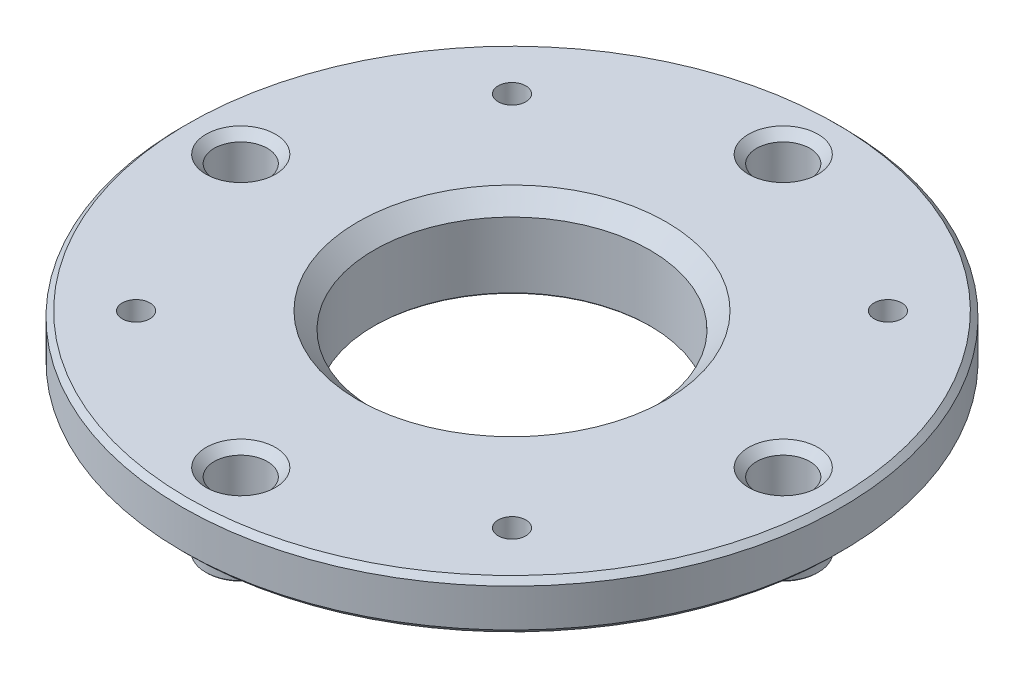
ISO-10303-21;
HEADER;
FILE_DESCRIPTION(('STEP AP214'),'2;1');
FILE_NAME('part.step','',(''),(''),'','','');
FILE_SCHEMA(('AUTOMOTIVE_DESIGN { 1 0 10303 214 1 1 1 1 }'));
ENDSEC;
DATA;
#1=APPLICATION_CONTEXT('core data for automotive mechanical design processes');
#2=APPLICATION_PROTOCOL_DEFINITION('international standard','automotive_design',2000,#1);
#3=PRODUCT_CONTEXT('',#1,'mechanical');
#4=PRODUCT('Part','Part','',(#3));
#5=PRODUCT_RELATED_PRODUCT_CATEGORY('part','',(#4));
#6=PRODUCT_DEFINITION_FORMATION('','',#4);
#7=PRODUCT_DEFINITION_CONTEXT('part definition',#1,'design');
#8=PRODUCT_DEFINITION('design','',#6,#7);
#9=PRODUCT_DEFINITION_SHAPE('','',#8);
#10=(LENGTH_UNIT() NAMED_UNIT(*) SI_UNIT(.MILLI.,.METRE.));
#11=(NAMED_UNIT(*) PLANE_ANGLE_UNIT() SI_UNIT($,.RADIAN.));
#12=(NAMED_UNIT(*) SI_UNIT($,.STERADIAN.) SOLID_ANGLE_UNIT());
#13=UNCERTAINTY_MEASURE_WITH_UNIT(LENGTH_MEASURE(1.E-05),#10,'distance_accuracy_value','');
#14=(GEOMETRIC_REPRESENTATION_CONTEXT(3) GLOBAL_UNCERTAINTY_ASSIGNED_CONTEXT((#13)) GLOBAL_UNIT_ASSIGNED_CONTEXT((#10,
#11,#12)) REPRESENTATION_CONTEXT('',''));
#15=CARTESIAN_POINT('',(0.,0.,0.));
#16=DIRECTION('',(0.,0.,1.));
#17=DIRECTION('',(1.,0.,0.));
#18=AXIS2_PLACEMENT_3D('',#15,#16,#17);
#19=CARTESIAN_POINT('',(0.,0.,0.));
#20=DIRECTION('',(0.,1.,0.));
#21=DIRECTION('',(0.,0.,1.));
#22=AXIS2_PLACEMENT_3D('',#19,#20,#21);
#23=PLANE('',#22);
#24=CARTESIAN_POINT('',(34.6482322781408,0.,34.6482322781409));
#25=DIRECTION('',(0.,-1.,0.));
#26=DIRECTION('',(0.,0.,-1.));
#27=AXIS2_PLACEMENT_3D('',#24,#25,#26);
#28=CIRCLE('',#27,2.55269999999999);
#29=CARTESIAN_POINT('',(34.6482322781408,0.,32.0955322781409));
#30=VERTEX_POINT('',#29);
#31=EDGE_CURVE('E240',#30,#30,#28,.T.);
#32=ORIENTED_EDGE('',*,*,#31,.F.);
#33=EDGE_LOOP('',(#32));
#34=FACE_BOUND('',#33,.T.);
#35=CARTESIAN_POINT('',(34.6482322781409,0.,-34.6482322781408));
#36=DIRECTION('',(0.,-1.,0.));
#37=DIRECTION('',(0.,0.,-1.));
#38=AXIS2_PLACEMENT_3D('',#35,#36,#37);
#39=CIRCLE('',#38,2.55269999999998);
#40=CARTESIAN_POINT('',(34.6482322781409,0.,-37.2009322781407));
#41=VERTEX_POINT('',#40);
#42=EDGE_CURVE('E233',#41,#41,#39,.T.);
#43=ORIENTED_EDGE('',*,*,#42,.F.);
#44=EDGE_LOOP('',(#43));
#45=FACE_BOUND('',#44,.T.);
#46=CARTESIAN_POINT('',(-34.6482322781408,0.,-34.6482322781409));
#47=DIRECTION('',(0.,-1.,0.));
#48=DIRECTION('',(0.,0.,-1.));
#49=AXIS2_PLACEMENT_3D('',#46,#47,#48);
#50=CIRCLE('',#49,2.55269999999998);
#51=CARTESIAN_POINT('',(-34.6482322781408,0.,-37.2009322781409));
#52=VERTEX_POINT('',#51);
#53=EDGE_CURVE('E225',#52,#52,#50,.T.);
#54=ORIENTED_EDGE('',*,*,#53,.F.);
#55=EDGE_LOOP('',(#54));
#56=FACE_BOUND('',#55,.T.);
#57=CARTESIAN_POINT('',(-34.6482322781409,0.,34.6482322781408));
#58=DIRECTION('',(0.,-1.,0.));
#59=DIRECTION('',(0.,0.,-1.));
#60=AXIS2_PLACEMENT_3D('',#57,#58,#59);
#61=CIRCLE('',#60,2.55269999999998);
#62=CARTESIAN_POINT('',(-34.6482322781409,0.,32.0955322781408));
#63=VERTEX_POINT('',#62);
#64=EDGE_CURVE('E217',#63,#63,#61,.T.);
#65=ORIENTED_EDGE('',*,*,#64,.F.);
#66=EDGE_LOOP('',(#65));
#67=FACE_BOUND('',#66,.T.);
#68=CARTESIAN_POINT('',(-50.,0.,0.));
#69=DIRECTION('',(0.,1.,0.));
#70=DIRECTION('',(0.,0.,1.));
#71=AXIS2_PLACEMENT_3D('',#68,#69,#70);
#72=CIRCLE('',#71,6.475);
#73=CARTESIAN_POINT('',(-50.,0.,6.47500000000001));
#74=VERTEX_POINT('',#73);
#75=EDGE_CURVE('E143',#74,#74,#72,.F.);
#76=ORIENTED_EDGE('',*,*,#75,.F.);
#77=EDGE_LOOP('',(#76));
#78=FACE_BOUND('',#77,.T.);
#79=CARTESIAN_POINT('',(50.,0.,0.));
#80=DIRECTION('',(0.,1.,0.));
#81=DIRECTION('',(0.,0.,1.));
#82=AXIS2_PLACEMENT_3D('',#79,#80,#81);
#83=CIRCLE('',#82,6.475);
#84=CARTESIAN_POINT('',(50.,0.,6.475));
#85=VERTEX_POINT('',#84);
#86=EDGE_CURVE('E151',#85,#85,#83,.F.);
#87=ORIENTED_EDGE('',*,*,#86,.F.);
#88=EDGE_LOOP('',(#87));
#89=FACE_BOUND('',#88,.T.);
#90=CARTESIAN_POINT('',(0.,0.,0.));
#91=DIRECTION('',(0.,1.,0.));
#92=DIRECTION('',(0.,0.,1.));
#93=AXIS2_PLACEMENT_3D('',#90,#91,#92);
#94=CIRCLE('',#93,59.75);
#95=CARTESIAN_POINT('',(0.,0.,59.75));
#96=VERTEX_POINT('',#95);
#97=EDGE_CURVE('E158',#96,#96,#94,.F.);
#98=ORIENTED_EDGE('',*,*,#97,.T.);
#99=EDGE_LOOP('',(#98));
#100=FACE_BOUND('',#99,.T.);
#101=CARTESIAN_POINT('',(0.,0.,0.));
#102=DIRECTION('',(0.,1.,0.));
#103=DIRECTION('',(0.,0.,1.));
#104=AXIS2_PLACEMENT_3D('',#101,#102,#103);
#105=CIRCLE('',#104,28.485);
#106=CARTESIAN_POINT('',(0.,0.,28.485));
#107=VERTEX_POINT('',#106);
#108=EDGE_CURVE('E210',#107,#107,#105,.F.);
#109=ORIENTED_EDGE('',*,*,#108,.F.);
#110=EDGE_LOOP('',(#109));
#111=FACE_BOUND('',#110,.T.);
#112=CARTESIAN_POINT('',(0.,0.,-50.));
#113=DIRECTION('',(0.,1.,0.));
#114=DIRECTION('',(0.,0.,1.));
#115=AXIS2_PLACEMENT_3D('',#112,#113,#114);
#116=CIRCLE('',#115,6.475);
#117=CARTESIAN_POINT('',(0.,0.,-43.525));
#118=VERTEX_POINT('',#117);
#119=EDGE_CURVE('E147',#118,#118,#116,.F.);
#120=ORIENTED_EDGE('',*,*,#119,.F.);
#121=EDGE_LOOP('',(#120));
#122=FACE_BOUND('',#121,.T.);
#123=CARTESIAN_POINT('',(0.,0.,50.));
#124=DIRECTION('',(0.,1.,0.));
#125=DIRECTION('',(0.,0.,1.));
#126=AXIS2_PLACEMENT_3D('',#123,#124,#125);
#127=CIRCLE('',#126,6.475);
#128=CARTESIAN_POINT('',(0.,0.,56.475));
#129=VERTEX_POINT('',#128);
#130=EDGE_CURVE('E139',#129,#129,#127,.F.);
#131=ORIENTED_EDGE('',*,*,#130,.F.);
#132=EDGE_LOOP('',(#131));
#133=FACE_BOUND('',#132,.T.);
#134=ADVANCED_FACE('F47',(#34,#45,#56,#67,#78,#89,#100,#111,#122,#133),#23,.F.);
#135=CARTESIAN_POINT('',(0.,9.,0.));
#136=DIRECTION('',(0.,1.,0.));
#137=DIRECTION('',(0.,0.,1.));
#138=AXIS2_PLACEMENT_3D('',#135,#136,#137);
#139=PLANE('',#138);
#140=CARTESIAN_POINT('',(34.6482322781408,9.,34.6482322781409));
#141=DIRECTION('',(0.,-1.,0.));
#142=DIRECTION('',(0.,0.,-1.));
#143=AXIS2_PLACEMENT_3D('',#140,#141,#142);
#144=CIRCLE('',#143,2.5527);
#145=CARTESIAN_POINT('',(34.6482322781408,9.,32.0955322781409));
#146=VERTEX_POINT('',#145);
#147=EDGE_CURVE('E237',#146,#146,#144,.T.);
#148=ORIENTED_EDGE('',*,*,#147,.T.);
#149=EDGE_LOOP('',(#148));
#150=FACE_BOUND('',#149,.T.);
#151=CARTESIAN_POINT('',(34.6482322781409,9.,-34.6482322781408));
#152=DIRECTION('',(0.,-1.,0.));
#153=DIRECTION('',(0.,0.,-1.));
#154=AXIS2_PLACEMENT_3D('',#151,#152,#153);
#155=CIRCLE('',#154,2.5527);
#156=CARTESIAN_POINT('',(34.6482322781409,9.,-37.2009322781408));
#157=VERTEX_POINT('',#156);
#158=EDGE_CURVE('E229',#157,#157,#155,.T.);
#159=ORIENTED_EDGE('',*,*,#158,.T.);
#160=EDGE_LOOP('',(#159));
#161=FACE_BOUND('',#160,.T.);
#162=CARTESIAN_POINT('',(-34.6482322781408,9.,-34.6482322781409));
#163=DIRECTION('',(0.,-1.,0.));
#164=DIRECTION('',(0.,0.,-1.));
#165=AXIS2_PLACEMENT_3D('',#162,#163,#164);
#166=CIRCLE('',#165,2.5527);
#167=CARTESIAN_POINT('',(-34.6482322781408,9.,-37.2009322781409));
#168=VERTEX_POINT('',#167);
#169=EDGE_CURVE('E221',#168,#168,#166,.T.);
#170=ORIENTED_EDGE('',*,*,#169,.T.);
#171=EDGE_LOOP('',(#170));
#172=FACE_BOUND('',#171,.T.);
#173=CARTESIAN_POINT('',(-34.6482322781409,9.,34.6482322781408));
#174=DIRECTION('',(0.,-1.,0.));
#175=DIRECTION('',(0.,0.,-1.));
#176=AXIS2_PLACEMENT_3D('',#173,#174,#175);
#177=CIRCLE('',#176,2.5527);
#178=CARTESIAN_POINT('',(-34.6482322781409,9.,32.0955322781408));
#179=VERTEX_POINT('',#178);
#180=EDGE_CURVE('E213',#179,#179,#177,.T.);
#181=ORIENTED_EDGE('',*,*,#180,.T.);
#182=EDGE_LOOP('',(#181));
#183=FACE_BOUND('',#182,.T.);
#184=CARTESIAN_POINT('',(0.,9.,0.));
#185=DIRECTION('',(0.,1.,0.));
#186=DIRECTION('',(0.,0.,1.));
#187=AXIS2_PLACEMENT_3D('',#184,#185,#186);
#188=CIRCLE('',#187,59.75);
#189=CARTESIAN_POINT('',(0.,9.,59.75));
#190=VERTEX_POINT('',#189);
#191=EDGE_CURVE('E155',#190,#190,#188,.T.);
#192=ORIENTED_EDGE('',*,*,#191,.T.);
#193=EDGE_LOOP('',(#192));
#194=FACE_BOUND('',#193,.T.);
#195=CARTESIAN_POINT('',(-50.,9.,0.));
#196=DIRECTION('',(0.,1.,0.));
#197=DIRECTION('',(0.,0.,1.));
#198=AXIS2_PLACEMENT_3D('',#195,#196,#197);
#199=CIRCLE('',#198,6.40219999999998);
#200=CARTESIAN_POINT('',(-50.,9.,6.40219999999999));
#201=VERTEX_POINT('',#200);
#202=EDGE_CURVE('E182',#201,#201,#199,.F.);
#203=ORIENTED_EDGE('',*,*,#202,.T.);
#204=EDGE_LOOP('',(#203));
#205=FACE_BOUND('',#204,.T.);
#206=CARTESIAN_POINT('',(0.,9.,50.));
#207=DIRECTION('',(0.,1.,0.));
#208=DIRECTION('',(0.,0.,1.));
#209=AXIS2_PLACEMENT_3D('',#206,#207,#208);
#210=CIRCLE('',#209,6.40219999999998);
#211=CARTESIAN_POINT('',(0.,9.,56.4022));
#212=VERTEX_POINT('',#211);
#213=EDGE_CURVE('E186',#212,#212,#210,.F.);
#214=ORIENTED_EDGE('',*,*,#213,.T.);
#215=EDGE_LOOP('',(#214));
#216=FACE_BOUND('',#215,.T.);
#217=CARTESIAN_POINT('',(50.,9.,0.));
#218=DIRECTION('',(0.,1.,0.));
#219=DIRECTION('',(0.,0.,1.));
#220=AXIS2_PLACEMENT_3D('',#217,#218,#219);
#221=CIRCLE('',#220,6.40219999999998);
#222=CARTESIAN_POINT('',(50.,9.,6.40219999999998));
#223=VERTEX_POINT('',#222);
#224=EDGE_CURVE('E190',#223,#223,#221,.F.);
#225=ORIENTED_EDGE('',*,*,#224,.T.);
#226=EDGE_LOOP('',(#225));
#227=FACE_BOUND('',#226,.T.);
#228=CARTESIAN_POINT('',(0.,9.,-50.));
#229=DIRECTION('',(0.,1.,0.));
#230=DIRECTION('',(0.,0.,1.));
#231=AXIS2_PLACEMENT_3D('',#228,#229,#230);
#232=CIRCLE('',#231,6.40219999999998);
#233=CARTESIAN_POINT('',(0.,9.,-43.5978));
#234=VERTEX_POINT('',#233);
#235=EDGE_CURVE('E194',#234,#234,#232,.F.);
#236=ORIENTED_EDGE('',*,*,#235,.T.);
#237=EDGE_LOOP('',(#236));
#238=FACE_BOUND('',#237,.T.);
#239=CARTESIAN_POINT('',(0.,9.,0.));
#240=DIRECTION('',(0.,1.,0.));
#241=DIRECTION('',(0.,0.,1.));
#242=AXIS2_PLACEMENT_3D('',#239,#240,#241);
#243=CIRCLE('',#242,28.425);
#244=CARTESIAN_POINT('',(0.,9.,28.425));
#245=VERTEX_POINT('',#244);
#246=EDGE_CURVE('E202',#245,#245,#243,.F.);
#247=ORIENTED_EDGE('',*,*,#246,.T.);
#248=EDGE_LOOP('',(#247));
#249=FACE_BOUND('',#248,.T.);
#250=ADVANCED_FACE('F249',(#150,#161,#172,#183,#194,#205,#216,#227,#238,#249),#139,.T.);
#251=CARTESIAN_POINT('',(0.,9.,0.));
#252=DIRECTION('',(0.,-1.,0.));
#253=DIRECTION('',(0.,0.,-1.));
#254=AXIS2_PLACEMENT_3D('',#251,#252,#253);
#255=CYLINDRICAL_SURFACE('',#254,60.75);
#256=CARTESIAN_POINT('',(0.,1.,0.));
#257=DIRECTION('',(0.,1.,0.));
#258=DIRECTION('',(0.,0.,1.));
#259=AXIS2_PLACEMENT_3D('',#256,#257,#258);
#260=CIRCLE('',#259,60.75);
#261=CARTESIAN_POINT('',(0.,1.,60.75));
#262=VERTEX_POINT('',#261);
#263=EDGE_CURVE('E162',#262,#262,#260,.T.);
#264=ORIENTED_EDGE('',*,*,#263,.T.);
#265=EDGE_LOOP('',(#264));
#266=FACE_BOUND('',#265,.T.);
#267=CARTESIAN_POINT('',(0.,8.,0.));
#268=DIRECTION('',(0.,1.,0.));
#269=DIRECTION('',(0.,0.,1.));
#270=AXIS2_PLACEMENT_3D('',#267,#268,#269);
#271=CIRCLE('',#270,60.75);
#272=CARTESIAN_POINT('',(0.,8.,60.75));
#273=VERTEX_POINT('',#272);
#274=EDGE_CURVE('E166',#273,#273,#271,.F.);
#275=ORIENTED_EDGE('',*,*,#274,.T.);
#276=EDGE_LOOP('',(#275));
#277=FACE_BOUND('',#276,.T.);
#278=ADVANCED_FACE('F338',(#266,#277),#255,.T.);
#279=CARTESIAN_POINT('',(0.,9.,-50.));
#280=DIRECTION('',(0.,-1.,0.));
#281=DIRECTION('',(0.,0.,-1.));
#282=AXIS2_PLACEMENT_3D('',#279,#280,#281);
#283=CYLINDRICAL_SURFACE('',#282,4.9022);
#284=CARTESIAN_POINT('',(0.,-4.5,-50.));
#285=DIRECTION('',(0.,-1.,0.));
#286=DIRECTION('',(0.,0.,-1.));
#287=AXIS2_PLACEMENT_3D('',#284,#285,#286);
#288=CIRCLE('',#287,4.9022);
#289=CARTESIAN_POINT('',(0.,-4.5,-54.9022));
#290=VERTEX_POINT('',#289);
#291=EDGE_CURVE('E103',#290,#290,#288,.T.);
#292=ORIENTED_EDGE('',*,*,#291,.T.);
#293=EDGE_LOOP('',(#292));
#294=FACE_BOUND('',#293,.T.);
#295=CARTESIAN_POINT('',(0.,7.50000000000003,-50.));
#296=DIRECTION('',(0.,1.,0.));
#297=DIRECTION('',(0.,0.,1.));
#298=AXIS2_PLACEMENT_3D('',#295,#296,#297);
#299=CIRCLE('',#298,4.9022);
#300=CARTESIAN_POINT('',(0.,7.50000000000003,-45.0978));
#301=VERTEX_POINT('',#300);
#302=EDGE_CURVE('E170',#301,#301,#299,.T.);
#303=ORIENTED_EDGE('',*,*,#302,.T.);
#304=EDGE_LOOP('',(#303));
#305=FACE_BOUND('',#304,.T.);
#306=ADVANCED_FACE('F334',(#294,#305),#283,.F.);
#307=CARTESIAN_POINT('',(0.,9.,0.));
#308=DIRECTION('',(0.,-1.,0.));
#309=DIRECTION('',(0.,0.,-1.));
#310=AXIS2_PLACEMENT_3D('',#307,#308,#309);
#311=CYLINDRICAL_SURFACE('',#310,25.425);
#312=CARTESIAN_POINT('',(0.,-6.10000000000003,0.));
#313=DIRECTION('',(0.,-1.,0.));
#314=DIRECTION('',(0.,0.,-1.));
#315=AXIS2_PLACEMENT_3D('',#312,#313,#314);
#316=CIRCLE('',#315,25.425);
#317=CARTESIAN_POINT('',(0.,-6.10000000000003,-25.425));
#318=VERTEX_POINT('',#317);
#319=EDGE_CURVE('E69',#318,#318,#316,.T.);
#320=ORIENTED_EDGE('',*,*,#319,.T.);
#321=EDGE_LOOP('',(#320));
#322=FACE_BOUND('',#321,.T.);
#323=CARTESIAN_POINT('',(0.,6.,0.));
#324=DIRECTION('',(0.,1.,0.));
#325=DIRECTION('',(0.,0.,1.));
#326=AXIS2_PLACEMENT_3D('',#323,#324,#325);
#327=CIRCLE('',#326,25.425);
#328=CARTESIAN_POINT('',(0.,6.,25.425));
#329=VERTEX_POINT('',#328);
#330=EDGE_CURVE('E206',#329,#329,#327,.T.);
#331=ORIENTED_EDGE('',*,*,#330,.T.);
#332=EDGE_LOOP('',(#331));
#333=FACE_BOUND('',#332,.T.);
#334=ADVANCED_FACE('F330',(#322,#333),#311,.F.);
#335=CARTESIAN_POINT('',(50.,9.,0.));
#336=DIRECTION('',(0.,-1.,0.));
#337=DIRECTION('',(0.,0.,-1.));
#338=AXIS2_PLACEMENT_3D('',#335,#336,#337);
#339=CYLINDRICAL_SURFACE('',#338,4.9022);
#340=CARTESIAN_POINT('',(50.,-4.5,0.));
#341=DIRECTION('',(0.,-1.,0.));
#342=DIRECTION('',(0.,0.,-1.));
#343=AXIS2_PLACEMENT_3D('',#340,#341,#342);
#344=CIRCLE('',#343,4.9022);
#345=CARTESIAN_POINT('',(50.,-4.5,-4.9022));
#346=VERTEX_POINT('',#345);
#347=EDGE_CURVE('E119',#346,#346,#344,.T.);
#348=ORIENTED_EDGE('',*,*,#347,.T.);
#349=EDGE_LOOP('',(#348));
#350=FACE_BOUND('',#349,.T.);
#351=CARTESIAN_POINT('',(50.,7.50000000000003,0.));
#352=DIRECTION('',(0.,1.,0.));
#353=DIRECTION('',(0.,0.,1.));
#354=AXIS2_PLACEMENT_3D('',#351,#352,#353);
#355=CIRCLE('',#354,4.9022);
#356=CARTESIAN_POINT('',(50.,7.50000000000003,4.9022));
#357=VERTEX_POINT('',#356);
#358=EDGE_CURVE('E174',#357,#357,#355,.T.);
#359=ORIENTED_EDGE('',*,*,#358,.T.);
#360=EDGE_LOOP('',(#359));
#361=FACE_BOUND('',#360,.T.);
#362=ADVANCED_FACE('F326',(#350,#361),#339,.F.);
#363=CARTESIAN_POINT('',(0.,9.,50.));
#364=DIRECTION('',(0.,-1.,0.));
#365=DIRECTION('',(0.,0.,-1.));
#366=AXIS2_PLACEMENT_3D('',#363,#364,#365);
#367=CYLINDRICAL_SURFACE('',#366,4.9022);
#368=CARTESIAN_POINT('',(0.,-4.5,50.));
#369=DIRECTION('',(0.,-1.,0.));
#370=DIRECTION('',(0.,0.,-1.));
#371=AXIS2_PLACEMENT_3D('',#368,#369,#370);
#372=CIRCLE('',#371,4.9022);
#373=CARTESIAN_POINT('',(0.,-4.5,45.0978));
#374=VERTEX_POINT('',#373);
#375=EDGE_CURVE('E135',#374,#374,#372,.T.);
#376=ORIENTED_EDGE('',*,*,#375,.T.);
#377=EDGE_LOOP('',(#376));
#378=FACE_BOUND('',#377,.T.);
#379=CARTESIAN_POINT('',(0.,7.50000000000003,50.));
#380=DIRECTION('',(0.,1.,0.));
#381=DIRECTION('',(0.,0.,1.));
#382=AXIS2_PLACEMENT_3D('',#379,#380,#381);
#383=CIRCLE('',#382,4.9022);
#384=CARTESIAN_POINT('',(0.,7.50000000000003,54.9022));
#385=VERTEX_POINT('',#384);
#386=EDGE_CURVE('E178',#385,#385,#383,.T.);
#387=ORIENTED_EDGE('',*,*,#386,.T.);
#388=EDGE_LOOP('',(#387));
#389=FACE_BOUND('',#388,.T.);
#390=ADVANCED_FACE('F322',(#378,#389),#367,.F.);
#391=CARTESIAN_POINT('',(-50.,9.,0.));
#392=DIRECTION('',(0.,-1.,0.));
#393=DIRECTION('',(0.,0.,-1.));
#394=AXIS2_PLACEMENT_3D('',#391,#392,#393);
#395=CYLINDRICAL_SURFACE('',#394,4.9022);
#396=CARTESIAN_POINT('',(-50.,-4.5,0.));
#397=DIRECTION('',(0.,-1.,0.));
#398=DIRECTION('',(0.,0.,-1.));
#399=AXIS2_PLACEMENT_3D('',#396,#397,#398);
#400=CIRCLE('',#399,4.9022);
#401=CARTESIAN_POINT('',(-50.,-4.5,-4.90219999999999));
#402=VERTEX_POINT('',#401);
#403=EDGE_CURVE('E87',#402,#402,#400,.T.);
#404=ORIENTED_EDGE('',*,*,#403,.T.);
#405=EDGE_LOOP('',(#404));
#406=FACE_BOUND('',#405,.T.);
#407=CARTESIAN_POINT('',(-50.,7.50000000000003,0.));
#408=DIRECTION('',(0.,1.,0.));
#409=DIRECTION('',(0.,0.,1.));
#410=AXIS2_PLACEMENT_3D('',#407,#408,#409);
#411=CIRCLE('',#410,4.9022);
#412=CARTESIAN_POINT('',(-50.,7.50000000000003,4.9022));
#413=VERTEX_POINT('',#412);
#414=EDGE_CURVE('E198',#413,#413,#411,.T.);
#415=ORIENTED_EDGE('',*,*,#414,.T.);
#416=EDGE_LOOP('',(#415));
#417=FACE_BOUND('',#416,.T.);
#418=ADVANCED_FACE('F316',(#406,#417),#395,.F.);
#419=CARTESIAN_POINT('',(0.,-6.35,0.));
#420=DIRECTION('',(0.,-1.,0.));
#421=DIRECTION('',(0.,0.,-1.));
#422=AXIS2_PLACEMENT_3D('',#419,#420,#421);
#423=PLANE('',#422);
#424=CARTESIAN_POINT('',(0.,-6.35,0.));
#425=DIRECTION('',(0.,-1.,0.));
#426=DIRECTION('',(0.,0.,-1.));
#427=AXIS2_PLACEMENT_3D('',#424,#425,#426);
#428=CIRCLE('',#427,27.485);
#429=CARTESIAN_POINT('',(0.,-6.35,-27.485));
#430=VERTEX_POINT('',#429);
#431=EDGE_CURVE('E56',#430,#430,#428,.T.);
#432=ORIENTED_EDGE('',*,*,#431,.T.);
#433=EDGE_LOOP('',(#432));
#434=FACE_BOUND('',#433,.T.);
#435=CARTESIAN_POINT('',(0.,-6.35,0.));
#436=DIRECTION('',(0.,-1.,0.));
#437=DIRECTION('',(0.,0.,-1.));
#438=AXIS2_PLACEMENT_3D('',#435,#436,#437);
#439=CIRCLE('',#438,25.675);
#440=CARTESIAN_POINT('',(0.,-6.35,-25.675));
#441=VERTEX_POINT('',#440);
#442=EDGE_CURVE('E63',#441,#441,#439,.F.);
#443=ORIENTED_EDGE('',*,*,#442,.T.);
#444=EDGE_LOOP('',(#443));
#445=FACE_BOUND('',#444,.T.);
#446=ADVANCED_FACE('F312',(#434,#445),#423,.T.);
#447=CARTESIAN_POINT('',(0.,-6.35,0.));
#448=DIRECTION('',(0.,1.,0.));
#449=DIRECTION('',(0.,0.,1.));
#450=AXIS2_PLACEMENT_3D('',#447,#448,#449);
#451=CYLINDRICAL_SURFACE('',#450,28.485);
#452=CARTESIAN_POINT('',(0.,-5.34999999999998,0.));
#453=DIRECTION('',(0.,-1.,0.));
#454=DIRECTION('',(0.,0.,-1.));
#455=AXIS2_PLACEMENT_3D('',#452,#453,#454);
#456=CIRCLE('',#455,28.485);
#457=CARTESIAN_POINT('',(0.,-5.34999999999998,-28.485));
#458=VERTEX_POINT('',#457);
#459=EDGE_CURVE('E10',#458,#458,#456,.F.);
#460=ORIENTED_EDGE('',*,*,#459,.T.);
#461=EDGE_LOOP('',(#460));
#462=FACE_BOUND('',#461,.T.);
#463=ORIENTED_EDGE('',*,*,#108,.T.);
#464=EDGE_LOOP('',(#463));
#465=FACE_BOUND('',#464,.T.);
#466=ADVANCED_FACE('F315',(#462,#465),#451,.T.);
#467=CARTESIAN_POINT('',(0.,6.,0.));
#468=DIRECTION('',(0.,1.,0.));
#469=DIRECTION('',(0.,0.,1.));
#470=AXIS2_PLACEMENT_3D('',#467,#468,#469);
#471=CONICAL_SURFACE('',#470,25.425,0.785398163397447);
#472=ORIENTED_EDGE('',*,*,#246,.F.);
#473=EDGE_LOOP('',(#472));
#474=FACE_BOUND('',#473,.T.);
#475=ORIENTED_EDGE('',*,*,#330,.F.);
#476=EDGE_LOOP('',(#475));
#477=FACE_BOUND('',#476,.T.);
#478=ADVANCED_FACE('F319',(#474,#477),#471,.F.);
#479=CARTESIAN_POINT('',(-50.,7.50000000000003,0.));
#480=DIRECTION('',(0.,1.,0.));
#481=DIRECTION('',(0.,0.,1.));
#482=AXIS2_PLACEMENT_3D('',#479,#480,#481);
#483=CONICAL_SURFACE('',#482,4.9022,0.785398163397452);
#484=ORIENTED_EDGE('',*,*,#202,.F.);
#485=EDGE_LOOP('',(#484));
#486=FACE_BOUND('',#485,.T.);
#487=ORIENTED_EDGE('',*,*,#414,.F.);
#488=EDGE_LOOP('',(#487));
#489=FACE_BOUND('',#488,.T.);
#490=ADVANCED_FACE('F352',(#486,#489),#483,.F.);
#491=CARTESIAN_POINT('',(0.,7.50000000000003,50.));
#492=DIRECTION('',(0.,1.,0.));
#493=DIRECTION('',(0.,0.,1.));
#494=AXIS2_PLACEMENT_3D('',#491,#492,#493);
#495=CONICAL_SURFACE('',#494,4.9022,0.785398163397452);
#496=CARTESIAN_POINT('',(0.,9.,56.4022));
#497=CARTESIAN_POINT('',(0.,8.984375,56.386575));
#498=CARTESIAN_POINT('',(0.,8.96875,56.37095));
#499=CARTESIAN_POINT('',(0.,8.9375,56.3397));
#500=CARTESIAN_POINT('',(0.,8.921875,56.324075));
#501=CARTESIAN_POINT('',(0.,8.890625,56.292825));
#502=CARTESIAN_POINT('',(0.,8.875,56.2772));
#503=CARTESIAN_POINT('',(0.,8.84375,56.24595));
#504=CARTESIAN_POINT('',(0.,8.828125,56.230325));
#505=CARTESIAN_POINT('',(0.,8.796875,56.199075));
#506=CARTESIAN_POINT('',(0.,8.78125,56.18345));
#507=CARTESIAN_POINT('',(0.,8.75,56.1522));
#508=CARTESIAN_POINT('',(0.,8.734375,56.136575));
#509=CARTESIAN_POINT('',(0.,8.703125,56.105325));
#510=CARTESIAN_POINT('',(0.,8.6875,56.0897));
#511=CARTESIAN_POINT('',(0.,8.65625,56.05845));
#512=CARTESIAN_POINT('',(0.,8.64062500000001,56.042825));
#513=CARTESIAN_POINT('',(0.,8.60937500000001,56.011575));
#514=CARTESIAN_POINT('',(0.,8.59375000000001,55.99595));
#515=CARTESIAN_POINT('',(0.,8.56250000000001,55.9647));
#516=CARTESIAN_POINT('',(0.,8.54687500000001,55.949075));
#517=CARTESIAN_POINT('',(0.,8.51562500000001,55.917825));
#518=CARTESIAN_POINT('',(0.,8.50000000000001,55.9022));
#519=CARTESIAN_POINT('',(0.,8.46875000000001,55.87095));
#520=CARTESIAN_POINT('',(0.,8.45312500000001,55.855325));
#521=CARTESIAN_POINT('',(0.,8.42187500000001,55.824075));
#522=CARTESIAN_POINT('',(0.,8.40625000000001,55.80845));
#523=CARTESIAN_POINT('',(0.,8.37500000000001,55.7772));
#524=CARTESIAN_POINT('',(0.,8.35937500000001,55.761575));
#525=CARTESIAN_POINT('',(0.,8.32812500000001,55.730325));
#526=CARTESIAN_POINT('',(0.,8.31250000000001,55.7147));
#527=CARTESIAN_POINT('',(0.,8.28125000000001,55.68345));
#528=CARTESIAN_POINT('',(0.,8.26562500000001,55.667825));
#529=CARTESIAN_POINT('',(0.,8.23437500000001,55.636575));
#530=CARTESIAN_POINT('',(0.,8.21875000000001,55.62095));
#531=CARTESIAN_POINT('',(0.,8.18750000000001,55.5897));
#532=CARTESIAN_POINT('',(0.,8.17187500000001,55.574075));
#533=CARTESIAN_POINT('',(0.,8.14062500000001,55.542825));
#534=CARTESIAN_POINT('',(0.,8.12500000000002,55.5272));
#535=CARTESIAN_POINT('',(0.,8.09375000000002,55.49595));
#536=CARTESIAN_POINT('',(0.,8.07812500000002,55.480325));
#537=CARTESIAN_POINT('',(0.,8.04687500000002,55.449075));
#538=CARTESIAN_POINT('',(0.,8.03125000000002,55.43345));
#539=CARTESIAN_POINT('',(0.,8.00000000000002,55.4022));
#540=CARTESIAN_POINT('',(0.,7.98437500000002,55.386575));
#541=CARTESIAN_POINT('',(0.,7.95312500000002,55.355325));
#542=CARTESIAN_POINT('',(0.,7.93750000000002,55.3397));
#543=CARTESIAN_POINT('',(0.,7.90625000000002,55.30845));
#544=CARTESIAN_POINT('',(0.,7.89062500000002,55.292825));
#545=CARTESIAN_POINT('',(0.,7.85937500000002,55.261575));
#546=CARTESIAN_POINT('',(0.,7.84375000000002,55.24595));
#547=CARTESIAN_POINT('',(0.,7.81250000000002,55.2147));
#548=CARTESIAN_POINT('',(0.,7.79687500000002,55.199075));
#549=CARTESIAN_POINT('',(0.,7.76562500000002,55.167825));
#550=CARTESIAN_POINT('',(0.,7.75000000000002,55.1522));
#551=CARTESIAN_POINT('',(0.,7.71875000000002,55.12095));
#552=CARTESIAN_POINT('',(0.,7.70312500000002,55.105325));
#553=CARTESIAN_POINT('',(0.,7.67187500000002,55.074075));
#554=CARTESIAN_POINT('',(0.,7.65625000000002,55.05845));
#555=CARTESIAN_POINT('',(0.,7.62500000000002,55.0272));
#556=CARTESIAN_POINT('',(0.,7.60937500000002,55.011575));
#557=CARTESIAN_POINT('',(0.,7.57812500000003,54.980325));
#558=CARTESIAN_POINT('',(0.,7.56250000000003,54.9647));
#559=CARTESIAN_POINT('',(0.,7.53125000000003,54.93345));
#560=CARTESIAN_POINT('',(0.,7.51562500000003,54.917825));
#561=CARTESIAN_POINT('',(0.,7.50000000000003,54.9022));
#562=B_SPLINE_CURVE_WITH_KNOTS('',3,(#496,#497,#498,#499,#500,#501,#502,#503,#504,#505,#506,
#507,#508,#509,#510,#511,#512,#513,#514,#515,#516,#517,#518,#519,#520,#521,#522,#523,#524,#525,
#526,#527,#528,#529,#530,#531,#532,#533,#534,#535,#536,#537,#538,#539,#540,#541,#542,#543,#544,
#545,#546,#547,#548,#549,#550,#551,#552,#553,#554,#555,#556,#557,#558,#559,#560,#561),
.UNSPECIFIED.,.F.,.F.,(4,2,2,2,2,2,2,2,2,2,2,2,2,2,2,2,2,2,2,2,2,2,2,2,2,2,2,2,2,2,2,2,4),(0.,
0.0662912607362401,0.132582521472474,0.198873782208714,0.265165042944953,0.331456303681188,
0.397747564417427,0.464038825153667,0.530330085889901,0.596621346626142,0.66291260736238,
0.729203868098614,0.795495128834855,0.861786389571093,0.928077650307329,0.994368911043567,
1.06066017177981,1.12695143251604,1.19324269325228,1.25953395398852,1.32582521472476,
1.39211647546099,1.45840773619723,1.52469899693347,1.59099025766971,1.65728151840595,
1.72357277914219,1.78986403987842,1.85615530061466,1.9224465613509,1.98873782208714,
2.05502908282337,2.12132034355961),.UNSPECIFIED.);
#563=EDGE_CURVE('BSEAM359',#212,#385,#562,.T.);
#564=ORIENTED_EDGE('',*,*,#213,.F.);
#565=ORIENTED_EDGE('',*,*,#386,.F.);
#566=ORIENTED_EDGE('',*,*,#563,.T.);
#567=ORIENTED_EDGE('',*,*,#563,.F.);
#568=EDGE_LOOP('',(#564,#566,#565,#567));
#569=FACE_BOUND('',#568,.T.);
#570=ADVANCED_FACE('F359',(#569),#495,.F.);
#571=CARTESIAN_POINT('',(50.,7.50000000000003,0.));
#572=DIRECTION('',(0.,1.,0.));
#573=DIRECTION('',(0.,0.,1.));
#574=AXIS2_PLACEMENT_3D('',#571,#572,#573);
#575=CONICAL_SURFACE('',#574,4.9022,0.785398163397452);
#576=ORIENTED_EDGE('',*,*,#224,.F.);
#577=EDGE_LOOP('',(#576));
#578=FACE_BOUND('',#577,.T.);
#579=ORIENTED_EDGE('',*,*,#358,.F.);
#580=EDGE_LOOP('',(#579));
#581=FACE_BOUND('',#580,.T.);
#582=ADVANCED_FACE('F366',(#578,#581),#575,.F.);
#583=CARTESIAN_POINT('',(0.,7.50000000000003,-50.));
#584=DIRECTION('',(0.,1.,0.));
#585=DIRECTION('',(0.,0.,1.));
#586=AXIS2_PLACEMENT_3D('',#583,#584,#585);
#587=CONICAL_SURFACE('',#586,4.9022,0.785398163397452);
#588=CARTESIAN_POINT('',(0.,9.,-43.5978));
#589=CARTESIAN_POINT('',(0.,8.984375,-43.613425));
#590=CARTESIAN_POINT('',(0.,8.96875,-43.62905));
#591=CARTESIAN_POINT('',(0.,8.9375,-43.6603));
#592=CARTESIAN_POINT('',(0.,8.921875,-43.675925));
#593=CARTESIAN_POINT('',(0.,8.890625,-43.707175));
#594=CARTESIAN_POINT('',(0.,8.875,-43.7228));
#595=CARTESIAN_POINT('',(0.,8.84375,-43.75405));
#596=CARTESIAN_POINT('',(0.,8.828125,-43.769675));
#597=CARTESIAN_POINT('',(0.,8.796875,-43.800925));
#598=CARTESIAN_POINT('',(0.,8.78125,-43.81655));
#599=CARTESIAN_POINT('',(0.,8.75,-43.8478));
#600=CARTESIAN_POINT('',(0.,8.734375,-43.863425));
#601=CARTESIAN_POINT('',(0.,8.703125,-43.894675));
#602=CARTESIAN_POINT('',(0.,8.6875,-43.9103));
#603=CARTESIAN_POINT('',(0.,8.65625,-43.94155));
#604=CARTESIAN_POINT('',(0.,8.64062500000001,-43.957175));
#605=CARTESIAN_POINT('',(0.,8.60937500000001,-43.988425));
#606=CARTESIAN_POINT('',(0.,8.59375000000001,-44.00405));
#607=CARTESIAN_POINT('',(0.,8.56250000000001,-44.0353));
#608=CARTESIAN_POINT('',(0.,8.54687500000001,-44.050925));
#609=CARTESIAN_POINT('',(0.,8.51562500000001,-44.082175));
#610=CARTESIAN_POINT('',(0.,8.50000000000001,-44.0978));
#611=CARTESIAN_POINT('',(0.,8.46875000000001,-44.12905));
#612=CARTESIAN_POINT('',(0.,8.45312500000001,-44.144675));
#613=CARTESIAN_POINT('',(0.,8.42187500000001,-44.175925));
#614=CARTESIAN_POINT('',(0.,8.40625000000001,-44.19155));
#615=CARTESIAN_POINT('',(0.,8.37500000000001,-44.2228));
#616=CARTESIAN_POINT('',(0.,8.35937500000001,-44.238425));
#617=CARTESIAN_POINT('',(0.,8.32812500000001,-44.269675));
#618=CARTESIAN_POINT('',(0.,8.31250000000001,-44.2853));
#619=CARTESIAN_POINT('',(0.,8.28125000000001,-44.31655));
#620=CARTESIAN_POINT('',(0.,8.26562500000001,-44.332175));
#621=CARTESIAN_POINT('',(0.,8.23437500000001,-44.363425));
#622=CARTESIAN_POINT('',(0.,8.21875000000001,-44.37905));
#623=CARTESIAN_POINT('',(0.,8.18750000000001,-44.4103));
#624=CARTESIAN_POINT('',(0.,8.17187500000001,-44.425925));
#625=CARTESIAN_POINT('',(0.,8.14062500000001,-44.457175));
#626=CARTESIAN_POINT('',(0.,8.12500000000002,-44.4728));
#627=CARTESIAN_POINT('',(0.,8.09375000000002,-44.50405));
#628=CARTESIAN_POINT('',(0.,8.07812500000002,-44.519675));
#629=CARTESIAN_POINT('',(0.,8.04687500000002,-44.550925));
#630=CARTESIAN_POINT('',(0.,8.03125000000002,-44.56655));
#631=CARTESIAN_POINT('',(0.,8.00000000000002,-44.5978));
#632=CARTESIAN_POINT('',(0.,7.98437500000002,-44.613425));
#633=CARTESIAN_POINT('',(0.,7.95312500000002,-44.644675));
#634=CARTESIAN_POINT('',(0.,7.93750000000002,-44.6603));
#635=CARTESIAN_POINT('',(0.,7.90625000000002,-44.69155));
#636=CARTESIAN_POINT('',(0.,7.89062500000002,-44.707175));
#637=CARTESIAN_POINT('',(0.,7.85937500000002,-44.738425));
#638=CARTESIAN_POINT('',(0.,7.84375000000002,-44.75405));
#639=CARTESIAN_POINT('',(0.,7.81250000000002,-44.7853));
#640=CARTESIAN_POINT('',(0.,7.79687500000002,-44.800925));
#641=CARTESIAN_POINT('',(0.,7.76562500000002,-44.832175));
#642=CARTESIAN_POINT('',(0.,7.75000000000002,-44.8478));
#643=CARTESIAN_POINT('',(0.,7.71875000000002,-44.87905));
#644=CARTESIAN_POINT('',(0.,7.70312500000002,-44.894675));
#645=CARTESIAN_POINT('',(0.,7.67187500000002,-44.925925));
#646=CARTESIAN_POINT('',(0.,7.65625000000002,-44.94155));
#647=CARTESIAN_POINT('',(0.,7.62500000000002,-44.9728));
#648=CARTESIAN_POINT('',(0.,7.60937500000002,-44.988425));
#649=CARTESIAN_POINT('',(0.,7.57812500000003,-45.019675));
#650=CARTESIAN_POINT('',(0.,7.56250000000003,-45.0353));
#651=CARTESIAN_POINT('',(0.,7.53125000000003,-45.06655));
#652=CARTESIAN_POINT('',(0.,7.51562500000003,-45.082175));
#653=CARTESIAN_POINT('',(0.,7.50000000000003,-45.0978));
#654=B_SPLINE_CURVE_WITH_KNOTS('',3,(#588,#589,#590,#591,#592,#593,#594,#595,#596,#597,#598,
#599,#600,#601,#602,#603,#604,#605,#606,#607,#608,#609,#610,#611,#612,#613,#614,#615,#616,#617,
#618,#619,#620,#621,#622,#623,#624,#625,#626,#627,#628,#629,#630,#631,#632,#633,#634,#635,#636,
#637,#638,#639,#640,#641,#642,#643,#644,#645,#646,#647,#648,#649,#650,#651,#652,#653),
.UNSPECIFIED.,.F.,.F.,(4,2,2,2,2,2,2,2,2,2,2,2,2,2,2,2,2,2,2,2,2,2,2,2,2,2,2,2,2,2,2,2,4),(0.,
0.0662912607362401,0.132582521472474,0.198873782208714,0.265165042944953,0.331456303681188,
0.397747564417427,0.464038825153667,0.530330085889901,0.596621346626142,0.66291260736238,
0.729203868098614,0.795495128834855,0.861786389571093,0.928077650307329,0.994368911043567,
1.06066017177981,1.12695143251604,1.19324269325228,1.25953395398852,1.32582521472476,
1.39211647546099,1.45840773619723,1.52469899693347,1.59099025766971,1.65728151840595,
1.72357277914219,1.78986403987842,1.85615530061466,1.9224465613509,1.98873782208714,
2.05502908282337,2.12132034355961),.UNSPECIFIED.);
#655=EDGE_CURVE('BSEAM373',#234,#301,#654,.T.);
#656=ORIENTED_EDGE('',*,*,#235,.F.);
#657=ORIENTED_EDGE('',*,*,#302,.F.);
#658=ORIENTED_EDGE('',*,*,#655,.T.);
#659=ORIENTED_EDGE('',*,*,#655,.F.);
#660=EDGE_LOOP('',(#656,#658,#657,#659));
#661=FACE_BOUND('',#660,.T.);
#662=ADVANCED_FACE('F373',(#661),#587,.F.);
#663=CARTESIAN_POINT('',(0.,1.,0.));
#664=DIRECTION('',(0.,1.,0.));
#665=DIRECTION('',(0.,0.,1.));
#666=AXIS2_PLACEMENT_3D('',#663,#664,#665);
#667=CONICAL_SURFACE('',#666,60.75,0.785398163397452);
#668=ORIENTED_EDGE('',*,*,#97,.F.);
#669=EDGE_LOOP('',(#668));
#670=FACE_BOUND('',#669,.T.);
#671=ORIENTED_EDGE('',*,*,#263,.F.);
#672=EDGE_LOOP('',(#671));
#673=FACE_BOUND('',#672,.T.);
#674=ADVANCED_FACE('F380',(#670,#673),#667,.T.);
#675=CARTESIAN_POINT('',(0.,9.,0.));
#676=DIRECTION('',(0.,-1.,0.));
#677=DIRECTION('',(0.,0.,-1.));
#678=AXIS2_PLACEMENT_3D('',#675,#676,#677);
#679=CONICAL_SURFACE('',#678,59.75,0.785398163397445);
#680=ORIENTED_EDGE('',*,*,#274,.F.);
#681=EDGE_LOOP('',(#680));
#682=FACE_BOUND('',#681,.T.);
#683=ORIENTED_EDGE('',*,*,#191,.F.);
#684=EDGE_LOOP('',(#683));
#685=FACE_BOUND('',#684,.T.);
#686=ADVANCED_FACE('F307',(#682,#685),#679,.T.);
#687=CARTESIAN_POINT('',(50.,-4.75,0.));
#688=DIRECTION('',(0.,-1.,0.));
#689=DIRECTION('',(0.,0.,-1.));
#690=AXIS2_PLACEMENT_3D('',#687,#688,#689);
#691=PLANE('',#690);
#692=CARTESIAN_POINT('',(50.,-4.75,0.));
#693=DIRECTION('',(0.,-1.,0.));
#694=DIRECTION('',(0.,0.,-1.));
#695=AXIS2_PLACEMENT_3D('',#692,#693,#694);
#696=CIRCLE('',#695,5.15220000000001);
#697=CARTESIAN_POINT('',(50.,-4.75,-5.15220000000001));
#698=VERTEX_POINT('',#697);
#699=EDGE_CURVE('E111',#698,#698,#696,.F.);
#700=ORIENTED_EDGE('',*,*,#699,.T.);
#701=EDGE_LOOP('',(#700));
#702=FACE_BOUND('',#701,.T.);
#703=CARTESIAN_POINT('',(50.,-4.75,0.));
#704=DIRECTION('',(0.,-1.,0.));
#705=DIRECTION('',(0.,0.,-1.));
#706=AXIS2_PLACEMENT_3D('',#703,#704,#705);
#707=CIRCLE('',#706,6.22499999999999);
#708=CARTESIAN_POINT('',(50.,-4.75,-6.225));
#709=VERTEX_POINT('',#708);
#710=EDGE_CURVE('E115',#709,#709,#707,.T.);
#711=ORIENTED_EDGE('',*,*,#710,.T.);
#712=EDGE_LOOP('',(#711));
#713=FACE_BOUND('',#712,.T.);
#714=ADVANCED_FACE('F304',(#702,#713),#691,.T.);
#715=CARTESIAN_POINT('',(50.,-4.75,0.));
#716=DIRECTION('',(0.,1.,0.));
#717=DIRECTION('',(0.,0.,1.));
#718=AXIS2_PLACEMENT_3D('',#715,#716,#717);
#719=CYLINDRICAL_SURFACE('',#718,6.475);
#720=CARTESIAN_POINT('',(50.,-4.49999999999998,0.));
#721=DIRECTION('',(0.,-1.,0.));
#722=DIRECTION('',(0.,0.,-1.));
#723=AXIS2_PLACEMENT_3D('',#720,#721,#722);
#724=CIRCLE('',#723,6.475);
#725=CARTESIAN_POINT('',(50.,-4.49999999999998,-6.475));
#726=VERTEX_POINT('',#725);
#727=EDGE_CURVE('E107',#726,#726,#724,.F.);
#728=ORIENTED_EDGE('',*,*,#727,.T.);
#729=EDGE_LOOP('',(#728));
#730=FACE_BOUND('',#729,.T.);
#731=ORIENTED_EDGE('',*,*,#86,.T.);
#732=EDGE_LOOP('',(#731));
#733=FACE_BOUND('',#732,.T.);
#734=ADVANCED_FACE('F302',(#730,#733),#719,.T.);
#735=CARTESIAN_POINT('',(0.,-4.75,-50.));
#736=DIRECTION('',(0.,-1.,0.));
#737=DIRECTION('',(0.,0.,-1.));
#738=AXIS2_PLACEMENT_3D('',#735,#736,#737);
#739=PLANE('',#738);
#740=CARTESIAN_POINT('',(0.,-4.75,-50.));
#741=DIRECTION('',(0.,-1.,0.));
#742=DIRECTION('',(0.,0.,-1.));
#743=AXIS2_PLACEMENT_3D('',#740,#741,#742);
#744=CIRCLE('',#743,5.15220000000001);
#745=CARTESIAN_POINT('',(0.,-4.75,-55.1522));
#746=VERTEX_POINT('',#745);
#747=EDGE_CURVE('E95',#746,#746,#744,.F.);
#748=ORIENTED_EDGE('',*,*,#747,.T.);
#749=EDGE_LOOP('',(#748));
#750=FACE_BOUND('',#749,.T.);
#751=CARTESIAN_POINT('',(0.,-4.75,-50.));
#752=DIRECTION('',(0.,-1.,0.));
#753=DIRECTION('',(0.,0.,-1.));
#754=AXIS2_PLACEMENT_3D('',#751,#752,#753);
#755=CIRCLE('',#754,6.22499999999995);
#756=CARTESIAN_POINT('',(0.,-4.75,-56.225));
#757=VERTEX_POINT('',#756);
#758=EDGE_CURVE('E99',#757,#757,#755,.T.);
#759=ORIENTED_EDGE('',*,*,#758,.T.);
#760=EDGE_LOOP('',(#759));
#761=FACE_BOUND('',#760,.T.);
#762=ADVANCED_FACE('F298',(#750,#761),#739,.T.);
#763=CARTESIAN_POINT('',(0.,-4.75,-50.));
#764=DIRECTION('',(0.,1.,0.));
#765=DIRECTION('',(0.,0.,1.));
#766=AXIS2_PLACEMENT_3D('',#763,#764,#765);
#767=CYLINDRICAL_SURFACE('',#766,6.475);
#768=CARTESIAN_POINT('',(0.,-4.49999999999996,-50.));
#769=DIRECTION('',(0.,-1.,0.));
#770=DIRECTION('',(0.,0.,-1.));
#771=AXIS2_PLACEMENT_3D('',#768,#769,#770);
#772=CIRCLE('',#771,6.475);
#773=CARTESIAN_POINT('',(0.,-4.49999999999996,-56.475));
#774=VERTEX_POINT('',#773);
#775=EDGE_CURVE('E91',#774,#774,#772,.F.);
#776=ORIENTED_EDGE('',*,*,#775,.T.);
#777=EDGE_LOOP('',(#776));
#778=FACE_BOUND('',#777,.T.);
#779=ORIENTED_EDGE('',*,*,#119,.T.);
#780=EDGE_LOOP('',(#779));
#781=FACE_BOUND('',#780,.T.);
#782=ADVANCED_FACE('F294',(#778,#781),#767,.T.);
#783=CARTESIAN_POINT('',(-50.,-4.75,0.));
#784=DIRECTION('',(0.,-1.,0.));
#785=DIRECTION('',(0.,0.,-1.));
#786=AXIS2_PLACEMENT_3D('',#783,#784,#785);
#787=PLANE('',#786);
#788=CARTESIAN_POINT('',(-50.,-4.75,0.));
#789=DIRECTION('',(0.,-1.,0.));
#790=DIRECTION('',(0.,0.,-1.));
#791=AXIS2_PLACEMENT_3D('',#788,#789,#790);
#792=CIRCLE('',#791,5.15220000000001);
#793=CARTESIAN_POINT('',(-50.,-4.75,-5.15220000000001));
#794=VERTEX_POINT('',#793);
#795=EDGE_CURVE('E79',#794,#794,#792,.F.);
#796=ORIENTED_EDGE('',*,*,#795,.T.);
#797=EDGE_LOOP('',(#796));
#798=FACE_BOUND('',#797,.T.);
#799=CARTESIAN_POINT('',(-50.,-4.75,0.));
#800=DIRECTION('',(0.,-1.,0.));
#801=DIRECTION('',(0.,0.,-1.));
#802=AXIS2_PLACEMENT_3D('',#799,#800,#801);
#803=CIRCLE('',#802,6.22499999999999);
#804=CARTESIAN_POINT('',(-50.,-4.75,-6.22499999999999));
#805=VERTEX_POINT('',#804);
#806=EDGE_CURVE('E83',#805,#805,#803,.T.);
#807=ORIENTED_EDGE('',*,*,#806,.T.);
#808=EDGE_LOOP('',(#807));
#809=FACE_BOUND('',#808,.T.);
#810=ADVANCED_FACE('F290',(#798,#809),#787,.T.);
#811=CARTESIAN_POINT('',(-50.,-4.75,0.));
#812=DIRECTION('',(0.,1.,0.));
#813=DIRECTION('',(0.,0.,1.));
#814=AXIS2_PLACEMENT_3D('',#811,#812,#813);
#815=CYLINDRICAL_SURFACE('',#814,6.475);
#816=CARTESIAN_POINT('',(-50.,-4.49999999999998,0.));
#817=DIRECTION('',(0.,-1.,0.));
#818=DIRECTION('',(0.,0.,-1.));
#819=AXIS2_PLACEMENT_3D('',#816,#817,#818);
#820=CIRCLE('',#819,6.475);
#821=CARTESIAN_POINT('',(-50.,-4.49999999999998,-6.475));
#822=VERTEX_POINT('',#821);
#823=EDGE_CURVE('E75',#822,#822,#820,.F.);
#824=ORIENTED_EDGE('',*,*,#823,.T.);
#825=EDGE_LOOP('',(#824));
#826=FACE_BOUND('',#825,.T.);
#827=ORIENTED_EDGE('',*,*,#75,.T.);
#828=EDGE_LOOP('',(#827));
#829=FACE_BOUND('',#828,.T.);
#830=ADVANCED_FACE('F281',(#826,#829),#815,.T.);
#831=CARTESIAN_POINT('',(0.,-4.75,50.));
#832=DIRECTION('',(0.,-1.,0.));
#833=DIRECTION('',(0.,0.,-1.));
#834=AXIS2_PLACEMENT_3D('',#831,#832,#833);
#835=PLANE('',#834);
#836=CARTESIAN_POINT('',(0.,-4.75,50.));
#837=DIRECTION('',(0.,-1.,0.));
#838=DIRECTION('',(0.,0.,-1.));
#839=AXIS2_PLACEMENT_3D('',#836,#837,#838);
#840=CIRCLE('',#839,5.15220000000001);
#841=CARTESIAN_POINT('',(0.,-4.75,44.8478));
#842=VERTEX_POINT('',#841);
#843=EDGE_CURVE('E127',#842,#842,#840,.F.);
#844=ORIENTED_EDGE('',*,*,#843,.T.);
#845=EDGE_LOOP('',(#844));
#846=FACE_BOUND('',#845,.T.);
#847=CARTESIAN_POINT('',(0.,-4.75,50.));
#848=DIRECTION('',(0.,-1.,0.));
#849=DIRECTION('',(0.,0.,-1.));
#850=AXIS2_PLACEMENT_3D('',#847,#848,#849);
#851=CIRCLE('',#850,6.22499999999995);
#852=CARTESIAN_POINT('',(0.,-4.75,43.775));
#853=VERTEX_POINT('',#852);
#854=EDGE_CURVE('E131',#853,#853,#851,.T.);
#855=ORIENTED_EDGE('',*,*,#854,.T.);
#856=EDGE_LOOP('',(#855));
#857=FACE_BOUND('',#856,.T.);
#858=ADVANCED_FACE('F272',(#846,#857),#835,.T.);
#859=CARTESIAN_POINT('',(0.,-4.75,50.));
#860=DIRECTION('',(0.,1.,0.));
#861=DIRECTION('',(0.,0.,1.));
#862=AXIS2_PLACEMENT_3D('',#859,#860,#861);
#863=CYLINDRICAL_SURFACE('',#862,6.475);
#864=CARTESIAN_POINT('',(0.,-4.49999999999996,50.));
#865=DIRECTION('',(0.,-1.,0.));
#866=DIRECTION('',(0.,0.,-1.));
#867=AXIS2_PLACEMENT_3D('',#864,#865,#866);
#868=CIRCLE('',#867,6.475);
#869=CARTESIAN_POINT('',(0.,-4.49999999999996,43.525));
#870=VERTEX_POINT('',#869);
#871=EDGE_CURVE('E123',#870,#870,#868,.F.);
#872=ORIENTED_EDGE('',*,*,#871,.T.);
#873=EDGE_LOOP('',(#872));
#874=FACE_BOUND('',#873,.T.);
#875=ORIENTED_EDGE('',*,*,#130,.T.);
#876=EDGE_LOOP('',(#875));
#877=FACE_BOUND('',#876,.T.);
#878=ADVANCED_FACE('F269',(#874,#877),#863,.T.);
#879=CARTESIAN_POINT('',(0.,-4.5,50.));
#880=DIRECTION('',(0.,-1.,0.));
#881=DIRECTION('',(0.,0.,-1.));
#882=AXIS2_PLACEMENT_3D('',#879,#880,#881);
#883=CONICAL_SURFACE('',#882,4.9022,0.785398163397474);
#884=ORIENTED_EDGE('',*,*,#843,.F.);
#885=EDGE_LOOP('',(#884));
#886=FACE_BOUND('',#885,.T.);
#887=ORIENTED_EDGE('',*,*,#375,.F.);
#888=EDGE_LOOP('',(#887));
#889=FACE_BOUND('',#888,.T.);
#890=ADVANCED_FACE('F271',(#886,#889),#883,.F.);
#891=CARTESIAN_POINT('',(0.,-4.75,50.));
#892=DIRECTION('',(0.,1.,0.));
#893=DIRECTION('',(0.,0.,1.));
#894=AXIS2_PLACEMENT_3D('',#891,#892,#893);
#895=CONICAL_SURFACE('',#894,6.22499999999995,0.785398163397462);
#896=ORIENTED_EDGE('',*,*,#871,.F.);
#897=EDGE_LOOP('',(#896));
#898=FACE_BOUND('',#897,.T.);
#899=ORIENTED_EDGE('',*,*,#854,.F.);
#900=EDGE_LOOP('',(#899));
#901=FACE_BOUND('',#900,.T.);
#902=ADVANCED_FACE('F278',(#898,#901),#895,.T.);
#903=CARTESIAN_POINT('',(50.,-4.5,0.));
#904=DIRECTION('',(0.,-1.,0.));
#905=DIRECTION('',(0.,0.,-1.));
#906=AXIS2_PLACEMENT_3D('',#903,#904,#905);
#907=CONICAL_SURFACE('',#906,4.9022,0.785398163397473);
#908=ORIENTED_EDGE('',*,*,#699,.F.);
#909=EDGE_LOOP('',(#908));
#910=FACE_BOUND('',#909,.T.);
#911=ORIENTED_EDGE('',*,*,#347,.F.);
#912=EDGE_LOOP('',(#911));
#913=FACE_BOUND('',#912,.T.);
#914=ADVANCED_FACE('F402',(#910,#913),#907,.F.);
#915=CARTESIAN_POINT('',(50.,-4.75,0.));
#916=DIRECTION('',(0.,1.,0.));
#917=DIRECTION('',(0.,0.,1.));
#918=AXIS2_PLACEMENT_3D('',#915,#916,#917);
#919=CONICAL_SURFACE('',#918,6.22499999999999,0.785398163397431);
#920=ORIENTED_EDGE('',*,*,#727,.F.);
#921=EDGE_LOOP('',(#920));
#922=FACE_BOUND('',#921,.T.);
#923=ORIENTED_EDGE('',*,*,#710,.F.);
#924=EDGE_LOOP('',(#923));
#925=FACE_BOUND('',#924,.T.);
#926=ADVANCED_FACE('F409',(#922,#925),#919,.T.);
#927=CARTESIAN_POINT('',(0.,-4.5,-50.));
#928=DIRECTION('',(0.,-1.,0.));
#929=DIRECTION('',(0.,0.,-1.));
#930=AXIS2_PLACEMENT_3D('',#927,#928,#929);
#931=CONICAL_SURFACE('',#930,4.9022,0.785398163397474);
#932=ORIENTED_EDGE('',*,*,#747,.F.);
#933=EDGE_LOOP('',(#932));
#934=FACE_BOUND('',#933,.T.);
#935=ORIENTED_EDGE('',*,*,#291,.F.);
#936=EDGE_LOOP('',(#935));
#937=FACE_BOUND('',#936,.T.);
#938=ADVANCED_FACE('F416',(#934,#937),#931,.F.);
#939=CARTESIAN_POINT('',(0.,-4.75,-50.));
#940=DIRECTION('',(0.,1.,0.));
#941=DIRECTION('',(0.,0.,1.));
#942=AXIS2_PLACEMENT_3D('',#939,#940,#941);
#943=CONICAL_SURFACE('',#942,6.22499999999995,0.785398163397462);
#944=ORIENTED_EDGE('',*,*,#775,.F.);
#945=EDGE_LOOP('',(#944));
#946=FACE_BOUND('',#945,.T.);
#947=ORIENTED_EDGE('',*,*,#758,.F.);
#948=EDGE_LOOP('',(#947));
#949=FACE_BOUND('',#948,.T.);
#950=ADVANCED_FACE('F423',(#946,#949),#943,.T.);
#951=CARTESIAN_POINT('',(-50.,-4.5,0.));
#952=DIRECTION('',(0.,-1.,0.));
#953=DIRECTION('',(0.,0.,-1.));
#954=AXIS2_PLACEMENT_3D('',#951,#952,#953);
#955=CONICAL_SURFACE('',#954,4.9022,0.785398163397473);
#956=ORIENTED_EDGE('',*,*,#795,.F.);
#957=EDGE_LOOP('',(#956));
#958=FACE_BOUND('',#957,.T.);
#959=ORIENTED_EDGE('',*,*,#403,.F.);
#960=EDGE_LOOP('',(#959));
#961=FACE_BOUND('',#960,.T.);
#962=ADVANCED_FACE('F430',(#958,#961),#955,.F.);
#963=CARTESIAN_POINT('',(-50.,-4.75,0.));
#964=DIRECTION('',(0.,1.,0.));
#965=DIRECTION('',(0.,0.,1.));
#966=AXIS2_PLACEMENT_3D('',#963,#964,#965);
#967=CONICAL_SURFACE('',#966,6.22499999999999,0.785398163397431);
#968=ORIENTED_EDGE('',*,*,#823,.F.);
#969=EDGE_LOOP('',(#968));
#970=FACE_BOUND('',#969,.T.);
#971=ORIENTED_EDGE('',*,*,#806,.F.);
#972=EDGE_LOOP('',(#971));
#973=FACE_BOUND('',#972,.T.);
#974=ADVANCED_FACE('F437',(#970,#973),#967,.T.);
#975=CARTESIAN_POINT('',(0.,-6.10000000000003,0.));
#976=DIRECTION('',(0.,-1.,0.));
#977=DIRECTION('',(0.,0.,-1.));
#978=AXIS2_PLACEMENT_3D('',#975,#976,#977);
#979=CONICAL_SURFACE('',#978,25.425,0.785398163397455);
#980=ORIENTED_EDGE('',*,*,#442,.F.);
#981=EDGE_LOOP('',(#980));
#982=FACE_BOUND('',#981,.T.);
#983=ORIENTED_EDGE('',*,*,#319,.F.);
#984=EDGE_LOOP('',(#983));
#985=FACE_BOUND('',#984,.T.);
#986=ADVANCED_FACE('F443',(#982,#985),#979,.F.);
#987=CARTESIAN_POINT('',(-34.6482322781409,0.,34.6482322781408));
#988=DIRECTION('',(0.,-1.,0.));
#989=DIRECTION('',(0.,0.,-1.));
#990=AXIS2_PLACEMENT_3D('',#987,#988,#989);
#991=CYLINDRICAL_SURFACE('',#990,2.55269999999999);
#992=ORIENTED_EDGE('',*,*,#180,.F.);
#993=EDGE_LOOP('',(#992));
#994=FACE_BOUND('',#993,.T.);
#995=ORIENTED_EDGE('',*,*,#64,.T.);
#996=EDGE_LOOP('',(#995));
#997=FACE_BOUND('',#996,.T.);
#998=ADVANCED_FACE('F285',(#994,#997),#991,.F.);
#999=CARTESIAN_POINT('',(-34.6482322781408,0.,-34.6482322781409));
#1000=DIRECTION('',(0.,-1.,0.));
#1001=DIRECTION('',(0.,0.,-1.));
#1002=AXIS2_PLACEMENT_3D('',#999,#1000,#1001);
#1003=CYLINDRICAL_SURFACE('',#1002,2.55269999999999);
#1004=ORIENTED_EDGE('',*,*,#169,.F.);
#1005=EDGE_LOOP('',(#1004));
#1006=FACE_BOUND('',#1005,.T.);
#1007=ORIENTED_EDGE('',*,*,#53,.T.);
#1008=EDGE_LOOP('',(#1007));
#1009=FACE_BOUND('',#1008,.T.);
#1010=ADVANCED_FACE('F451',(#1006,#1009),#1003,.F.);
#1011=CARTESIAN_POINT('',(34.6482322781409,0.,-34.6482322781408));
#1012=DIRECTION('',(0.,-1.,0.));
#1013=DIRECTION('',(0.,0.,-1.));
#1014=AXIS2_PLACEMENT_3D('',#1011,#1012,#1013);
#1015=CYLINDRICAL_SURFACE('',#1014,2.55269999999999);
#1016=ORIENTED_EDGE('',*,*,#158,.F.);
#1017=EDGE_LOOP('',(#1016));
#1018=FACE_BOUND('',#1017,.T.);
#1019=ORIENTED_EDGE('',*,*,#42,.T.);
#1020=EDGE_LOOP('',(#1019));
#1021=FACE_BOUND('',#1020,.T.);
#1022=ADVANCED_FACE('F462',(#1018,#1021),#1015,.F.);
#1023=CARTESIAN_POINT('',(34.6482322781408,0.,34.6482322781409));
#1024=DIRECTION('',(0.,-1.,0.));
#1025=DIRECTION('',(0.,0.,-1.));
#1026=AXIS2_PLACEMENT_3D('',#1023,#1024,#1025);
#1027=CYLINDRICAL_SURFACE('',#1026,2.55269999999999);
#1028=ORIENTED_EDGE('',*,*,#147,.F.);
#1029=EDGE_LOOP('',(#1028));
#1030=FACE_BOUND('',#1029,.T.);
#1031=ORIENTED_EDGE('',*,*,#31,.T.);
#1032=EDGE_LOOP('',(#1031));
#1033=FACE_BOUND('',#1032,.T.);
#1034=ADVANCED_FACE('F245',(#1030,#1033),#1027,.F.);
#1035=CARTESIAN_POINT('',(0.,-6.35,0.));
#1036=DIRECTION('',(0.,1.,0.));
#1037=DIRECTION('',(0.,0.,1.));
#1038=AXIS2_PLACEMENT_3D('',#1035,#1036,#1037);
#1039=CONICAL_SURFACE('',#1038,27.485,0.785398163397433);
#1040=ORIENTED_EDGE('',*,*,#459,.F.);
#1041=EDGE_LOOP('',(#1040));
#1042=FACE_BOUND('',#1041,.T.);
#1043=ORIENTED_EDGE('',*,*,#431,.F.);
#1044=EDGE_LOOP('',(#1043));
#1045=FACE_BOUND('',#1044,.T.);
#1046=ADVANCED_FACE('F50',(#1042,#1045),#1039,.T.);
#1047=CLOSED_SHELL('',(#134,#250,#278,#306,#334,#362,#390,#418,#446,#466,#478,#490,#570,#582,
#662,#674,#686,#714,#734,#762,#782,#810,#830,#858,#878,#890,#902,#914,#926,#938,#950,#962,#974,
#986,#998,#1010,#1022,#1034,#1046));
#1048=MANIFOLD_SOLID_BREP('B2',#1047);
#1049=ADVANCED_BREP_SHAPE_REPRESENTATION('',(#18,#1048),#14);
#1050=SHAPE_DEFINITION_REPRESENTATION(#9,#1049);
ENDSEC;
END-ISO-10303-21;
